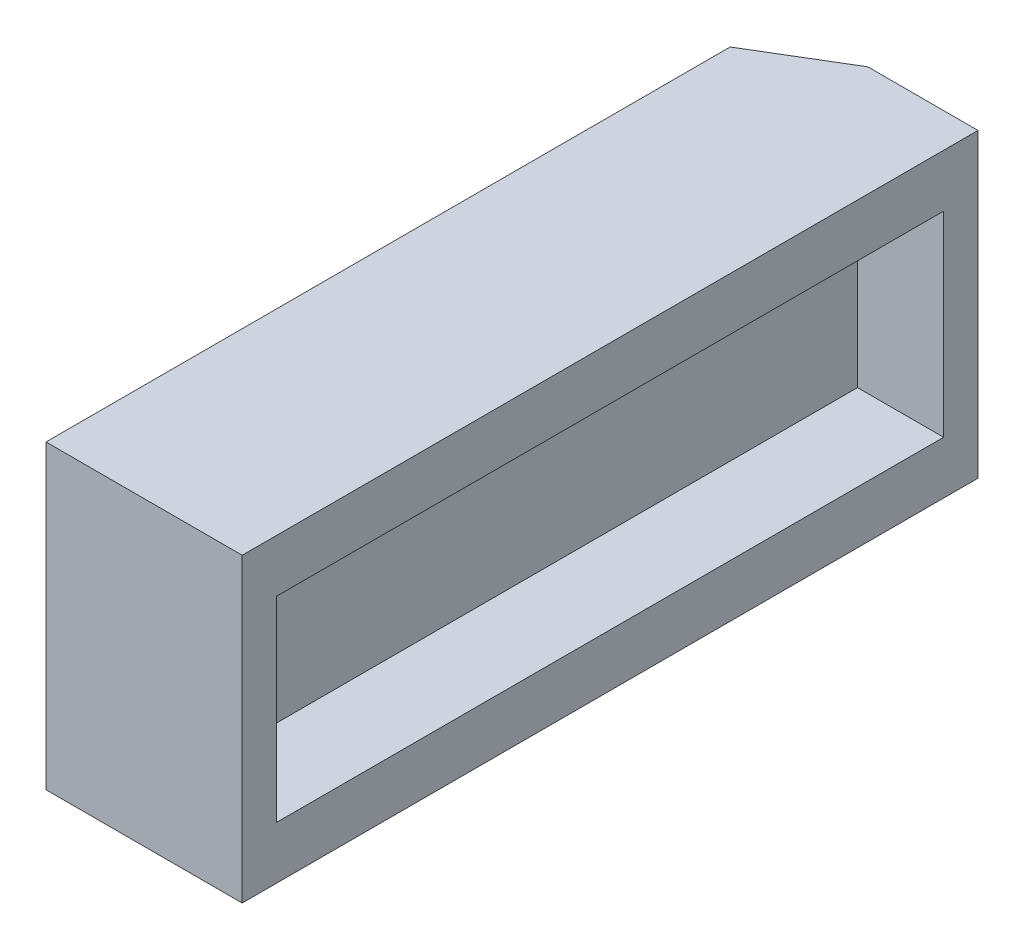
ISO-10303-21;
HEADER;
FILE_DESCRIPTION(('STEP AP214'),'2;1');
FILE_NAME('part.step','',(''),(''),'','','');
FILE_SCHEMA(('AUTOMOTIVE_DESIGN { 1 0 10303 214 1 1 1 1 }'));
ENDSEC;
DATA;
#1=APPLICATION_CONTEXT('core data for automotive mechanical design processes');
#2=APPLICATION_PROTOCOL_DEFINITION('international standard','automotive_design',2000,#1);
#3=PRODUCT_CONTEXT('',#1,'mechanical');
#4=PRODUCT('Part','Part','',(#3));
#5=PRODUCT_RELATED_PRODUCT_CATEGORY('part','',(#4));
#6=PRODUCT_DEFINITION_FORMATION('','',#4);
#7=PRODUCT_DEFINITION_CONTEXT('part definition',#1,'design');
#8=PRODUCT_DEFINITION('design','',#6,#7);
#9=PRODUCT_DEFINITION_SHAPE('','',#8);
#10=(LENGTH_UNIT() NAMED_UNIT(*) SI_UNIT(.MILLI.,.METRE.));
#11=(NAMED_UNIT(*) PLANE_ANGLE_UNIT() SI_UNIT($,.RADIAN.));
#12=(NAMED_UNIT(*) SI_UNIT($,.STERADIAN.) SOLID_ANGLE_UNIT());
#13=UNCERTAINTY_MEASURE_WITH_UNIT(LENGTH_MEASURE(1.E-05),#10,'distance_accuracy_value','');
#14=(GEOMETRIC_REPRESENTATION_CONTEXT(3) GLOBAL_UNCERTAINTY_ASSIGNED_CONTEXT((#13)) GLOBAL_UNIT_ASSIGNED_CONTEXT((#10,
#11,#12)) REPRESENTATION_CONTEXT('',''));
#15=CARTESIAN_POINT('',(0.,0.,0.));
#16=DIRECTION('',(0.,0.,1.));
#17=DIRECTION('',(1.,0.,0.));
#18=AXIS2_PLACEMENT_3D('',#15,#16,#17);
#19=CARTESIAN_POINT('',(12.7,0.,0.));
#20=DIRECTION('',(1.,0.,0.));
#21=DIRECTION('',(0.,0.,-1.));
#22=AXIS2_PLACEMENT_3D('',#19,#20,#21);
#23=PLANE('',#22);
#24=DIRECTION('',(0.,-1.,0.));
#25=VECTOR('',#24,1.);
#26=CARTESIAN_POINT('',(12.7,36.6776,5.08));
#27=LINE('',#26,#25);
#28=CARTESIAN_POINT('',(12.7,36.6776,5.08));
#29=VERTEX_POINT('',#28);
#30=CARTESIAN_POINT('',(12.7,-7.7724,5.08));
#31=VERTEX_POINT('',#30);
#32=EDGE_CURVE('E356',#29,#31,#27,.T.);
#33=ORIENTED_EDGE('',*,*,#32,.T.);
#34=DIRECTION('',(0.,0.,-1.));
#35=VECTOR('',#34,1.);
#36=CARTESIAN_POINT('',(12.7,-7.7724,5.08));
#37=LINE('',#36,#35);
#38=CARTESIAN_POINT('',(12.7,-7.7724,-103.505));
#39=VERTEX_POINT('',#38);
#40=EDGE_CURVE('E359',#31,#39,#37,.T.);
#41=ORIENTED_EDGE('',*,*,#40,.T.);
#42=DIRECTION('',(0.,1.,0.));
#43=VECTOR('',#42,1.);
#44=CARTESIAN_POINT('',(12.7,36.6776,-103.505));
#45=LINE('',#44,#43);
#46=CARTESIAN_POINT('',(12.7,36.6776,-103.505));
#47=VERTEX_POINT('',#46);
#48=EDGE_CURVE('E196',#39,#47,#45,.T.);
#49=ORIENTED_EDGE('',*,*,#48,.T.);
#50=DIRECTION('',(0.,0.,1.));
#51=VECTOR('',#50,1.);
#52=CARTESIAN_POINT('',(12.7,36.6776,5.08));
#53=LINE('',#52,#51);
#54=EDGE_CURVE('E362',#47,#29,#53,.T.);
#55=ORIENTED_EDGE('',*,*,#54,.T.);
#56=EDGE_LOOP('',(#33,#41,#49,#55));
#57=FACE_BOUND('',#56,.T.);
#58=DIRECTION('',(0.,0.,-1.));
#59=VECTOR('',#58,1.);
#60=CARTESIAN_POINT('',(12.7,0.,0.));
#61=LINE('',#60,#59);
#62=CARTESIAN_POINT('',(12.7,0.,0.));
#63=VERTEX_POINT('',#62);
#64=CARTESIAN_POINT('',(12.7,0.,-98.425));
#65=VERTEX_POINT('',#64);
#66=EDGE_CURVE('E329',#63,#65,#61,.T.);
#67=ORIENTED_EDGE('',*,*,#66,.F.);
#68=DIRECTION('',(0.,-1.,0.));
#69=VECTOR('',#68,1.);
#70=CARTESIAN_POINT('',(12.7,0.,0.));
#71=LINE('',#70,#69);
#72=CARTESIAN_POINT('',(12.7,28.9052,0.));
#73=VERTEX_POINT('',#72);
#74=EDGE_CURVE('E327',#73,#63,#71,.T.);
#75=ORIENTED_EDGE('',*,*,#74,.F.);
#76=DIRECTION('',(0.,0.,1.));
#77=VECTOR('',#76,1.);
#78=CARTESIAN_POINT('',(12.7,28.9052,0.));
#79=LINE('',#78,#77);
#80=CARTESIAN_POINT('',(12.7,28.9052,-98.425));
#81=VERTEX_POINT('',#80);
#82=EDGE_CURVE('E335',#81,#73,#79,.T.);
#83=ORIENTED_EDGE('',*,*,#82,.F.);
#84=DIRECTION('',(0.,1.,0.));
#85=VECTOR('',#84,1.);
#86=CARTESIAN_POINT('',(12.7,0.,-98.425));
#87=LINE('',#86,#85);
#88=EDGE_CURVE('E332',#65,#81,#87,.T.);
#89=ORIENTED_EDGE('',*,*,#88,.F.);
#90=EDGE_LOOP('',(#67,#75,#83,#89));
#91=FACE_BOUND('',#90,.T.);
#92=ADVANCED_FACE('F35',(#57,#91),#23,.T.);
#93=CARTESIAN_POINT('',(12.7,36.6776,5.08));
#94=DIRECTION('',(0.,0.,-1.));
#95=DIRECTION('',(-1.,0.,0.));
#96=AXIS2_PLACEMENT_3D('',#93,#94,#95);
#97=PLANE('',#96);
#98=DIRECTION('',(-1.,0.,0.));
#99=VECTOR('',#98,1.);
#100=CARTESIAN_POINT('',(12.7,36.6776,5.08));
#101=LINE('',#100,#99);
#102=CARTESIAN_POINT('',(-16.256,36.6776,5.07999999999999));
#103=VERTEX_POINT('',#102);
#104=EDGE_CURVE('E203',#29,#103,#101,.T.);
#105=ORIENTED_EDGE('',*,*,#104,.T.);
#106=DIRECTION('',(0.,1.,0.));
#107=VECTOR('',#106,1.);
#108=CARTESIAN_POINT('',(-16.256,36.6776,5.07999999999999));
#109=LINE('',#108,#107);
#110=CARTESIAN_POINT('',(-16.256,-7.7724,5.08));
#111=VERTEX_POINT('',#110);
#112=EDGE_CURVE('E316',#111,#103,#109,.T.);
#113=ORIENTED_EDGE('',*,*,#112,.F.);
#114=DIRECTION('',(-1.,0.,0.));
#115=VECTOR('',#114,1.);
#116=CARTESIAN_POINT('',(12.7,-7.7724,5.08));
#117=LINE('',#116,#115);
#118=EDGE_CURVE('E197',#31,#111,#117,.T.);
#119=ORIENTED_EDGE('',*,*,#118,.F.);
#120=ORIENTED_EDGE('',*,*,#32,.F.);
#121=EDGE_LOOP('',(#105,#113,#119,#120));
#122=FACE_BOUND('',#121,.T.);
#123=ADVANCED_FACE('F368',(#122),#97,.F.);
#124=CARTESIAN_POINT('',(12.7,-7.7724,5.08));
#125=DIRECTION('',(0.,1.,0.));
#126=DIRECTION('',(0.,0.,1.));
#127=AXIS2_PLACEMENT_3D('',#124,#125,#126);
#128=PLANE('',#127);
#129=ORIENTED_EDGE('',*,*,#118,.T.);
#130=DIRECTION('',(0.,0.,1.));
#131=VECTOR('',#130,1.);
#132=CARTESIAN_POINT('',(-16.256,-7.7724,5.08));
#133=LINE('',#132,#131);
#134=CARTESIAN_POINT('',(-16.256,-7.7724,-95.885));
#135=VERTEX_POINT('',#134);
#136=EDGE_CURVE('E191',#135,#111,#133,.T.);
#137=ORIENTED_EDGE('',*,*,#136,.F.);
#138=DIRECTION('',(0.857492925712544,0.,-0.514495755427527));
#139=VECTOR('',#138,1.);
#140=CARTESIAN_POINT('',(-16.256,-7.7724,-95.885));
#141=LINE('',#140,#139);
#142=CARTESIAN_POINT('',(-3.556,-7.7724,-103.505));
#143=VERTEX_POINT('',#142);
#144=EDGE_CURVE('E171',#135,#143,#141,.T.);
#145=ORIENTED_EDGE('',*,*,#144,.T.);
#146=DIRECTION('',(-1.,0.,0.));
#147=VECTOR('',#146,1.);
#148=CARTESIAN_POINT('',(12.7,-7.7724,-103.505));
#149=LINE('',#148,#147);
#150=EDGE_CURVE('E188',#39,#143,#149,.T.);
#151=ORIENTED_EDGE('',*,*,#150,.F.);
#152=ORIENTED_EDGE('',*,*,#40,.F.);
#153=EDGE_LOOP('',(#129,#137,#145,#151,#152));
#154=FACE_BOUND('',#153,.T.);
#155=ADVANCED_FACE('F187',(#154),#128,.F.);
#156=CARTESIAN_POINT('',(12.7,36.6776,-103.505));
#157=DIRECTION('',(0.,0.,1.));
#158=DIRECTION('',(1.,0.,0.));
#159=AXIS2_PLACEMENT_3D('',#156,#157,#158);
#160=PLANE('',#159);
#161=ORIENTED_EDGE('',*,*,#150,.T.);
#162=DIRECTION('',(0.,-1.,0.));
#163=VECTOR('',#162,1.);
#164=CARTESIAN_POINT('',(-3.556,14.7344178129071,-103.505));
#165=LINE('',#164,#163);
#166=CARTESIAN_POINT('',(-3.556,2.4638,-103.505));
#167=VERTEX_POINT('',#166);
#168=EDGE_CURVE('E168',#167,#143,#165,.T.);
#169=ORIENTED_EDGE('',*,*,#168,.F.);
#170=DIRECTION('',(0.,-1.,0.));
#171=VECTOR('',#170,1.);
#172=CARTESIAN_POINT('',(-3.556,36.6776,-103.505));
#173=LINE('',#172,#171);
#174=CARTESIAN_POINT('',(-3.556,26.4414,-103.505));
#175=VERTEX_POINT('',#174);
#176=EDGE_CURVE('E323',#175,#167,#173,.T.);
#177=ORIENTED_EDGE('',*,*,#176,.F.);
#178=CARTESIAN_POINT('',(-3.556,36.6776,-103.505));
#179=VERTEX_POINT('',#178);
#180=EDGE_CURVE('E324',#179,#175,#173,.T.);
#181=ORIENTED_EDGE('',*,*,#180,.F.);
#182=DIRECTION('',(-1.,0.,0.));
#183=VECTOR('',#182,1.);
#184=CARTESIAN_POINT('',(12.7,36.6776,-103.505));
#185=LINE('',#184,#183);
#186=EDGE_CURVE('E198',#47,#179,#185,.T.);
#187=ORIENTED_EDGE('',*,*,#186,.F.);
#188=ORIENTED_EDGE('',*,*,#48,.F.);
#189=EDGE_LOOP('',(#161,#169,#177,#181,#187,#188));
#190=FACE_BOUND('',#189,.T.);
#191=ADVANCED_FACE('F194',(#190),#160,.F.);
#192=CARTESIAN_POINT('',(12.7,36.6776,5.08));
#193=DIRECTION('',(0.,-1.,0.));
#194=DIRECTION('',(0.,0.,-1.));
#195=AXIS2_PLACEMENT_3D('',#192,#193,#194);
#196=PLANE('',#195);
#197=ORIENTED_EDGE('',*,*,#186,.T.);
#198=DIRECTION('',(-0.857492925712544,0.,0.514495755427527));
#199=VECTOR('',#198,1.);
#200=CARTESIAN_POINT('',(-16.256,36.6776,-95.885));
#201=LINE('',#200,#199);
#202=CARTESIAN_POINT('',(-16.256,36.6776,-95.885));
#203=VERTEX_POINT('',#202);
#204=EDGE_CURVE('E181',#179,#203,#201,.T.);
#205=ORIENTED_EDGE('',*,*,#204,.T.);
#206=DIRECTION('',(0.,0.,-1.));
#207=VECTOR('',#206,1.);
#208=CARTESIAN_POINT('',(-16.256,36.6776,5.07999999999999));
#209=LINE('',#208,#207);
#210=EDGE_CURVE('E319',#103,#203,#209,.T.);
#211=ORIENTED_EDGE('',*,*,#210,.F.);
#212=ORIENTED_EDGE('',*,*,#104,.F.);
#213=ORIENTED_EDGE('',*,*,#54,.F.);
#214=EDGE_LOOP('',(#197,#205,#211,#212,#213));
#215=FACE_BOUND('',#214,.T.);
#216=ADVANCED_FACE('F372',(#215),#196,.F.);
#217=CARTESIAN_POINT('',(12.7,0.,0.));
#218=DIRECTION('',(0.,0.,-1.));
#219=DIRECTION('',(0.,1.,0.));
#220=AXIS2_PLACEMENT_3D('',#217,#218,#219);
#221=PLANE('',#220);
#222=DIRECTION('',(0.,-1.,0.));
#223=VECTOR('',#222,1.);
#224=CARTESIAN_POINT('',(0.,0.,0.));
#225=LINE('',#224,#223);
#226=CARTESIAN_POINT('',(0.,28.9052,0.));
#227=VERTEX_POINT('',#226);
#228=CARTESIAN_POINT('',(0.,0.,0.));
#229=VERTEX_POINT('',#228);
#230=EDGE_CURVE('E326',#227,#229,#225,.T.);
#231=ORIENTED_EDGE('',*,*,#230,.F.);
#232=DIRECTION('',(-1.,0.,0.));
#233=VECTOR('',#232,1.);
#234=CARTESIAN_POINT('',(12.7,28.9052,0.));
#235=LINE('',#234,#233);
#236=EDGE_CURVE('E337',#73,#227,#235,.T.);
#237=ORIENTED_EDGE('',*,*,#236,.F.);
#238=ORIENTED_EDGE('',*,*,#74,.T.);
#239=DIRECTION('',(-1.,0.,0.));
#240=VECTOR('',#239,1.);
#241=CARTESIAN_POINT('',(12.7,0.,0.));
#242=LINE('',#241,#240);
#243=EDGE_CURVE('E353',#63,#229,#242,.T.);
#244=ORIENTED_EDGE('',*,*,#243,.T.);
#245=EDGE_LOOP('',(#231,#237,#238,#244));
#246=FACE_BOUND('',#245,.T.);
#247=ADVANCED_FACE('F404',(#246),#221,.T.);
#248=CARTESIAN_POINT('',(12.7,0.,0.));
#249=DIRECTION('',(0.,1.,0.));
#250=DIRECTION('',(0.,0.,1.));
#251=AXIS2_PLACEMENT_3D('',#248,#249,#250);
#252=PLANE('',#251);
#253=DIRECTION('',(0.,0.,-1.));
#254=VECTOR('',#253,1.);
#255=CARTESIAN_POINT('',(0.,0.,0.));
#256=LINE('',#255,#254);
#257=CARTESIAN_POINT('',(0.,0.,-98.425));
#258=VERTEX_POINT('',#257);
#259=EDGE_CURVE('E340',#229,#258,#256,.T.);
#260=ORIENTED_EDGE('',*,*,#259,.F.);
#261=ORIENTED_EDGE('',*,*,#243,.F.);
#262=ORIENTED_EDGE('',*,*,#66,.T.);
#263=DIRECTION('',(-1.,0.,0.));
#264=VECTOR('',#263,1.);
#265=CARTESIAN_POINT('',(12.7,0.,-98.425));
#266=LINE('',#265,#264);
#267=EDGE_CURVE('E351',#65,#258,#266,.T.);
#268=ORIENTED_EDGE('',*,*,#267,.T.);
#269=EDGE_LOOP('',(#260,#261,#262,#268));
#270=FACE_BOUND('',#269,.T.);
#271=ADVANCED_FACE('F589',(#270),#252,.T.);
#272=CARTESIAN_POINT('',(12.7,0.,-98.425));
#273=DIRECTION('',(0.,0.,1.));
#274=DIRECTION('',(1.,0.,0.));
#275=AXIS2_PLACEMENT_3D('',#272,#273,#274);
#276=PLANE('',#275);
#277=DIRECTION('',(0.,1.,0.));
#278=VECTOR('',#277,1.);
#279=CARTESIAN_POINT('',(0.,0.,-98.425));
#280=LINE('',#279,#278);
#281=CARTESIAN_POINT('',(0.,28.9052,-98.425));
#282=VERTEX_POINT('',#281);
#283=EDGE_CURVE('E343',#258,#282,#280,.T.);
#284=ORIENTED_EDGE('',*,*,#283,.F.);
#285=ORIENTED_EDGE('',*,*,#267,.F.);
#286=ORIENTED_EDGE('',*,*,#88,.T.);
#287=DIRECTION('',(-1.,0.,0.));
#288=VECTOR('',#287,1.);
#289=CARTESIAN_POINT('',(12.7,28.9052,-98.425));
#290=LINE('',#289,#288);
#291=EDGE_CURVE('E349',#81,#282,#290,.T.);
#292=ORIENTED_EDGE('',*,*,#291,.T.);
#293=EDGE_LOOP('',(#284,#285,#286,#292));
#294=FACE_BOUND('',#293,.T.);
#295=ADVANCED_FACE('F596',(#294),#276,.T.);
#296=CARTESIAN_POINT('',(12.7,28.9052,0.));
#297=DIRECTION('',(0.,-1.,0.));
#298=DIRECTION('',(0.,0.,-1.));
#299=AXIS2_PLACEMENT_3D('',#296,#297,#298);
#300=PLANE('',#299);
#301=DIRECTION('',(0.,0.,1.));
#302=VECTOR('',#301,1.);
#303=CARTESIAN_POINT('',(0.,28.9052,0.));
#304=LINE('',#303,#302);
#305=EDGE_CURVE('E330',#282,#227,#304,.T.);
#306=ORIENTED_EDGE('',*,*,#305,.F.);
#307=ORIENTED_EDGE('',*,*,#291,.F.);
#308=ORIENTED_EDGE('',*,*,#82,.T.);
#309=ORIENTED_EDGE('',*,*,#236,.T.);
#310=EDGE_LOOP('',(#306,#307,#308,#309));
#311=FACE_BOUND('',#310,.T.);
#312=ADVANCED_FACE('F603',(#311),#300,.T.);
#313=CARTESIAN_POINT('',(0.,0.,0.));
#314=DIRECTION('',(-1.,0.,0.));
#315=DIRECTION('',(0.,0.,1.));
#316=AXIS2_PLACEMENT_3D('',#313,#314,#315);
#317=PLANE('',#316);
#318=ORIENTED_EDGE('',*,*,#305,.T.);
#319=ORIENTED_EDGE('',*,*,#230,.T.);
#320=ORIENTED_EDGE('',*,*,#259,.T.);
#321=ORIENTED_EDGE('',*,*,#283,.T.);
#322=EDGE_LOOP('',(#318,#319,#320,#321));
#323=FACE_BOUND('',#322,.T.);
#324=ADVANCED_FACE('F569',(#323),#317,.F.);
#325=CARTESIAN_POINT('',(-3.556,0.,0.));
#326=DIRECTION('',(-1.,0.,0.));
#327=DIRECTION('',(0.,0.,1.));
#328=AXIS2_PLACEMENT_3D('',#325,#326,#327);
#329=PLANE('',#328);
#330=ORIENTED_EDGE('',*,*,#176,.T.);
#331=DIRECTION('',(0.,0.,1.));
#332=VECTOR('',#331,1.);
#333=CARTESIAN_POINT('',(-3.556,2.4638,-95.885));
#334=LINE('',#333,#332);
#335=CARTESIAN_POINT('',(-3.556,2.4638,-98.425));
#336=VERTEX_POINT('',#335);
#337=EDGE_CURVE('E222',#167,#336,#334,.T.);
#338=ORIENTED_EDGE('',*,*,#337,.T.);
#339=DIRECTION('',(0.,-1.,0.));
#340=VECTOR('',#339,1.);
#341=CARTESIAN_POINT('',(-3.556,0.,-98.425));
#342=LINE('',#341,#340);
#343=CARTESIAN_POINT('',(-3.556,26.4414,-98.425));
#344=VERTEX_POINT('',#343);
#345=EDGE_CURVE('E220',#336,#344,#342,.F.);
#346=ORIENTED_EDGE('',*,*,#345,.T.);
#347=DIRECTION('',(0.,0.,-1.));
#348=VECTOR('',#347,1.);
#349=CARTESIAN_POINT('',(-3.556,26.4414,-103.505));
#350=LINE('',#349,#348);
#351=EDGE_CURVE('E217',#344,#175,#350,.T.);
#352=ORIENTED_EDGE('',*,*,#351,.T.);
#353=EDGE_LOOP('',(#330,#338,#346,#352));
#354=FACE_BOUND('',#353,.T.);
#355=ADVANCED_FACE('F385',(#354),#329,.T.);
#356=CARTESIAN_POINT('',(-16.256,0.,0.));
#357=DIRECTION('',(1.,0.,0.));
#358=DIRECTION('',(0.,0.,-1.));
#359=AXIS2_PLACEMENT_3D('',#356,#357,#358);
#360=PLANE('',#359);
#361=ORIENTED_EDGE('',*,*,#112,.T.);
#362=ORIENTED_EDGE('',*,*,#210,.T.);
#363=DIRECTION('',(0.,-1.,0.));
#364=VECTOR('',#363,1.);
#365=CARTESIAN_POINT('',(-16.256,36.6776,-95.885));
#366=LINE('',#365,#364);
#367=CARTESIAN_POINT('',(-16.256,26.4414,-95.885));
#368=VERTEX_POINT('',#367);
#369=EDGE_CURVE('E53',#203,#368,#366,.T.);
#370=ORIENTED_EDGE('',*,*,#369,.T.);
#371=CARTESIAN_POINT('',(-16.256,2.4638,-95.885));
#372=VERTEX_POINT('',#371);
#373=EDGE_CURVE('E266',#368,#372,#366,.T.);
#374=ORIENTED_EDGE('',*,*,#373,.T.);
#375=DIRECTION('',(0.,-1.,0.));
#376=VECTOR('',#375,1.);
#377=CARTESIAN_POINT('',(-16.256,14.7344178129071,-95.885));
#378=LINE('',#377,#376);
#379=EDGE_CURVE('E192',#372,#135,#378,.T.);
#380=ORIENTED_EDGE('',*,*,#379,.T.);
#381=ORIENTED_EDGE('',*,*,#136,.T.);
#382=EDGE_LOOP('',(#361,#362,#370,#374,#380,#381));
#383=FACE_BOUND('',#382,.T.);
#384=DIRECTION('',(0.,1.,0.));
#385=VECTOR('',#384,1.);
#386=CARTESIAN_POINT('',(-16.256,28.9814,0.));
#387=LINE('',#386,#385);
#388=CARTESIAN_POINT('',(-16.256,-0.0761999999999985,0.));
#389=VERTEX_POINT('',#388);
#390=CARTESIAN_POINT('',(-16.256,28.9814,0.));
#391=VERTEX_POINT('',#390);
#392=EDGE_CURVE('E288',#389,#391,#387,.T.);
#393=ORIENTED_EDGE('',*,*,#392,.F.);
#394=DIRECTION('',(0.,0.,1.));
#395=VECTOR('',#394,1.);
#396=CARTESIAN_POINT('',(-16.256,-0.0761999999999985,0.));
#397=LINE('',#396,#395);
#398=CARTESIAN_POINT('',(-16.256,-0.0761999999999985,-90.805));
#399=VERTEX_POINT('',#398);
#400=EDGE_CURVE('E296',#399,#389,#397,.T.);
#401=ORIENTED_EDGE('',*,*,#400,.F.);
#402=DIRECTION('',(0.,-1.,0.));
#403=VECTOR('',#402,1.);
#404=CARTESIAN_POINT('',(-16.256,28.9814,-90.805));
#405=LINE('',#404,#403);
#406=CARTESIAN_POINT('',(-16.256,28.9814,-90.805));
#407=VERTEX_POINT('',#406);
#408=EDGE_CURVE('E293',#407,#399,#405,.T.);
#409=ORIENTED_EDGE('',*,*,#408,.F.);
#410=DIRECTION('',(0.,0.,-1.));
#411=VECTOR('',#410,1.);
#412=CARTESIAN_POINT('',(-16.256,28.9814,0.));
#413=LINE('',#412,#411);
#414=EDGE_CURVE('E290',#391,#407,#413,.T.);
#415=ORIENTED_EDGE('',*,*,#414,.F.);
#416=EDGE_LOOP('',(#393,#401,#409,#415));
#417=FACE_BOUND('',#416,.T.);
#418=ADVANCED_FACE('F373',(#383,#417),#360,.F.);
#419=CARTESIAN_POINT('',(-16.256,36.6776,-95.885));
#420=DIRECTION('',(0.,0.,1.));
#421=DIRECTION('',(0.,-1.,0.));
#422=AXIS2_PLACEMENT_3D('',#419,#420,#421);
#423=PLANE('',#422);
#424=DIRECTION('',(0.,-1.,0.));
#425=VECTOR('',#424,1.);
#426=CARTESIAN_POINT('',(-6.096,36.6776,-95.885));
#427=LINE('',#426,#425);
#428=CARTESIAN_POINT('',(-6.096,26.4414,-95.885));
#429=VERTEX_POINT('',#428);
#430=CARTESIAN_POINT('',(-6.096,2.4638,-95.885));
#431=VERTEX_POINT('',#430);
#432=EDGE_CURVE('E208',#429,#431,#427,.T.);
#433=ORIENTED_EDGE('',*,*,#432,.T.);
#434=DIRECTION('',(-1.,0.,0.));
#435=VECTOR('',#434,1.);
#436=CARTESIAN_POINT('',(-16.256,2.4638,-95.885));
#437=LINE('',#436,#435);
#438=EDGE_CURVE('E210',#431,#372,#437,.T.);
#439=ORIENTED_EDGE('',*,*,#438,.T.);
#440=ORIENTED_EDGE('',*,*,#373,.F.);
#441=DIRECTION('',(1.,0.,0.));
#442=VECTOR('',#441,1.);
#443=CARTESIAN_POINT('',(-16.256,26.4414,-95.885));
#444=LINE('',#443,#442);
#445=EDGE_CURVE('E200',#368,#429,#444,.T.);
#446=ORIENTED_EDGE('',*,*,#445,.T.);
#447=EDGE_LOOP('',(#433,#439,#440,#446));
#448=FACE_BOUND('',#447,.T.);
#449=ADVANCED_FACE('F263',(#448),#423,.F.);
#450=CARTESIAN_POINT('',(-16.256,28.9814,0.));
#451=DIRECTION('',(0.,0.,-1.));
#452=DIRECTION('',(-1.,0.,0.));
#453=AXIS2_PLACEMENT_3D('',#450,#451,#452);
#454=PLANE('',#453);
#455=DIRECTION('',(0.,1.,0.));
#456=VECTOR('',#455,1.);
#457=CARTESIAN_POINT('',(-3.556,28.9814,0.));
#458=LINE('',#457,#456);
#459=CARTESIAN_POINT('',(-3.556,-0.0761999999999985,0.));
#460=VERTEX_POINT('',#459);
#461=CARTESIAN_POINT('',(-3.556,28.9814,0.));
#462=VERTEX_POINT('',#461);
#463=EDGE_CURVE('E280',#460,#462,#458,.T.);
#464=ORIENTED_EDGE('',*,*,#463,.F.);
#465=DIRECTION('',(1.,0.,0.));
#466=VECTOR('',#465,1.);
#467=CARTESIAN_POINT('',(-16.256,-0.0761999999999985,0.));
#468=LINE('',#467,#466);
#469=EDGE_CURVE('E297',#389,#460,#468,.T.);
#470=ORIENTED_EDGE('',*,*,#469,.F.);
#471=ORIENTED_EDGE('',*,*,#392,.T.);
#472=DIRECTION('',(1.,0.,0.));
#473=VECTOR('',#472,1.);
#474=CARTESIAN_POINT('',(-16.256,28.9814,0.));
#475=LINE('',#474,#473);
#476=EDGE_CURVE('E313',#391,#462,#475,.T.);
#477=ORIENTED_EDGE('',*,*,#476,.T.);
#478=EDGE_LOOP('',(#464,#470,#471,#477));
#479=FACE_BOUND('',#478,.T.);
#480=ADVANCED_FACE('F540',(#479),#454,.T.);
#481=CARTESIAN_POINT('',(-16.256,28.9814,0.));
#482=DIRECTION('',(0.,-1.,0.));
#483=DIRECTION('',(0.,0.,-1.));
#484=AXIS2_PLACEMENT_3D('',#481,#482,#483);
#485=PLANE('',#484);
#486=DIRECTION('',(0.,0.,-1.));
#487=VECTOR('',#486,1.);
#488=CARTESIAN_POINT('',(-3.556,28.9814,0.));
#489=LINE('',#488,#487);
#490=CARTESIAN_POINT('',(-3.556,28.9814,-90.805));
#491=VERTEX_POINT('',#490);
#492=EDGE_CURVE('E283',#462,#491,#489,.T.);
#493=ORIENTED_EDGE('',*,*,#492,.F.);
#494=ORIENTED_EDGE('',*,*,#476,.F.);
#495=ORIENTED_EDGE('',*,*,#414,.T.);
#496=DIRECTION('',(1.,0.,0.));
#497=VECTOR('',#496,1.);
#498=CARTESIAN_POINT('',(-16.256,28.9814,-90.805));
#499=LINE('',#498,#497);
#500=EDGE_CURVE('E311',#407,#491,#499,.T.);
#501=ORIENTED_EDGE('',*,*,#500,.T.);
#502=EDGE_LOOP('',(#493,#494,#495,#501));
#503=FACE_BOUND('',#502,.T.);
#504=ADVANCED_FACE('F531',(#503),#485,.T.);
#505=CARTESIAN_POINT('',(-16.256,28.9814,-90.805));
#506=DIRECTION('',(0.,0.,1.));
#507=DIRECTION('',(1.,0.,0.));
#508=AXIS2_PLACEMENT_3D('',#505,#506,#507);
#509=PLANE('',#508);
#510=DIRECTION('',(0.,-1.,0.));
#511=VECTOR('',#510,1.);
#512=CARTESIAN_POINT('',(-3.556,28.9814,-90.805));
#513=LINE('',#512,#511);
#514=CARTESIAN_POINT('',(-3.556,-0.0761999999999985,-90.805));
#515=VERTEX_POINT('',#514);
#516=EDGE_CURVE('E301',#491,#515,#513,.T.);
#517=ORIENTED_EDGE('',*,*,#516,.F.);
#518=ORIENTED_EDGE('',*,*,#500,.F.);
#519=ORIENTED_EDGE('',*,*,#408,.T.);
#520=DIRECTION('',(1.,0.,0.));
#521=VECTOR('',#520,1.);
#522=CARTESIAN_POINT('',(-16.256,-0.0761999999999985,-90.805));
#523=LINE('',#522,#521);
#524=EDGE_CURVE('E308',#399,#515,#523,.T.);
#525=ORIENTED_EDGE('',*,*,#524,.T.);
#526=EDGE_LOOP('',(#517,#518,#519,#525));
#527=FACE_BOUND('',#526,.T.);
#528=ADVANCED_FACE('F522',(#527),#509,.T.);
#529=CARTESIAN_POINT('',(-16.256,-0.0761999999999985,0.));
#530=DIRECTION('',(0.,1.,0.));
#531=DIRECTION('',(0.,0.,1.));
#532=AXIS2_PLACEMENT_3D('',#529,#530,#531);
#533=PLANE('',#532);
#534=DIRECTION('',(0.,0.,1.));
#535=VECTOR('',#534,1.);
#536=CARTESIAN_POINT('',(-3.556,-0.0761999999999985,0.));
#537=LINE('',#536,#535);
#538=EDGE_CURVE('E291',#515,#460,#537,.T.);
#539=ORIENTED_EDGE('',*,*,#538,.F.);
#540=ORIENTED_EDGE('',*,*,#524,.F.);
#541=ORIENTED_EDGE('',*,*,#400,.T.);
#542=ORIENTED_EDGE('',*,*,#469,.T.);
#543=EDGE_LOOP('',(#539,#540,#541,#542));
#544=FACE_BOUND('',#543,.T.);
#545=ADVANCED_FACE('F516',(#544),#533,.T.);
#546=ORIENTED_EDGE('',*,*,#516,.T.);
#547=ORIENTED_EDGE('',*,*,#538,.T.);
#548=ORIENTED_EDGE('',*,*,#463,.T.);
#549=ORIENTED_EDGE('',*,*,#492,.T.);
#550=EDGE_LOOP('',(#546,#547,#548,#549));
#551=FACE_BOUND('',#550,.T.);
#552=ADVANCED_FACE('F503',(#551),#329,.T.);
#553=CARTESIAN_POINT('',(-16.256,28.9814,0.));
#554=DIRECTION('',(0.,-1.,0.));
#555=DIRECTION('',(0.,0.,-1.));
#556=AXIS2_PLACEMENT_3D('',#553,#554,#555);
#557=PLANE('',#556);
#558=DIRECTION('',(0.,0.,-1.));
#559=VECTOR('',#558,1.);
#560=CARTESIAN_POINT('',(-6.096,28.9814,-95.885));
#561=LINE('',#560,#559);
#562=CARTESIAN_POINT('',(-6.096,28.9814,-101.981));
#563=VERTEX_POINT('',#562);
#564=CARTESIAN_POINT('',(-6.096,28.9814,-98.425));
#565=VERTEX_POINT('',#564);
#566=EDGE_CURVE('E224',#563,#565,#561,.F.);
#567=ORIENTED_EDGE('',*,*,#566,.T.);
#568=DIRECTION('',(1.,0.,0.));
#569=VECTOR('',#568,1.);
#570=CARTESIAN_POINT('',(-16.256,28.9814,-98.425));
#571=LINE('',#570,#569);
#572=CARTESIAN_POINT('',(-12.0226666666667,28.9814,-98.425));
#573=VERTEX_POINT('',#572);
#574=EDGE_CURVE('E226',#565,#573,#571,.F.);
#575=ORIENTED_EDGE('',*,*,#574,.T.);
#576=DIRECTION('',(-0.857492925712544,0.,0.514495755427527));
#577=VECTOR('',#576,1.);
#578=CARTESIAN_POINT('',(-16.256,28.9814,-95.885));
#579=LINE('',#578,#577);
#580=EDGE_CURVE('E275',#563,#573,#579,.T.);
#581=ORIENTED_EDGE('',*,*,#580,.F.);
#582=EDGE_LOOP('',(#567,#575,#581));
#583=FACE_BOUND('',#582,.T.);
#584=ADVANCED_FACE('F274',(#583),#557,.T.);
#585=CARTESIAN_POINT('',(-16.256,14.1707821870929,-95.885));
#586=DIRECTION('',(-0.514495755427527,0.,-0.857492925712544));
#587=DIRECTION('',(-0.857492925712544,0.,0.514495755427527));
#588=AXIS2_PLACEMENT_3D('',#585,#586,#587);
#589=PLANE('',#588);
#590=ORIENTED_EDGE('',*,*,#180,.T.);
#591=CARTESIAN_POINT('',(-6.096,26.4414,-101.981));
#592=DIRECTION('',(-0.514495755427527,0.,-0.857492925712544));
#593=DIRECTION('',(-0.857492925712544,0.,0.514495755427527));
#594=AXIS2_PLACEMENT_3D('',#591,#592,#593);
#595=ELLIPSE('',#594,2.96212356258141,2.54);
#596=EDGE_CURVE('E11',#175,#563,#595,.F.);
#597=ORIENTED_EDGE('',*,*,#596,.T.);
#598=ORIENTED_EDGE('',*,*,#580,.T.);
#599=CARTESIAN_POINT('',(-12.0226666666667,26.4414,-98.425));
#600=DIRECTION('',(-0.514495755427527,0.,-0.857492925712544));
#601=DIRECTION('',(0.857492925712544,0.,-0.514495755427527));
#602=AXIS2_PLACEMENT_3D('',#599,#600,#601);
#603=ELLIPSE('',#602,4.93687260430235,2.54);
#604=EDGE_CURVE('E45',#573,#368,#603,.F.);
#605=ORIENTED_EDGE('',*,*,#604,.T.);
#606=ORIENTED_EDGE('',*,*,#369,.F.);
#607=ORIENTED_EDGE('',*,*,#204,.F.);
#608=EDGE_LOOP('',(#590,#597,#598,#605,#606,#607));
#609=FACE_BOUND('',#608,.T.);
#610=ADVANCED_FACE('F278',(#609),#589,.T.);
#611=CARTESIAN_POINT('',(-16.256,-0.0761999999999985,0.));
#612=DIRECTION('',(0.,1.,0.));
#613=DIRECTION('',(0.,0.,1.));
#614=AXIS2_PLACEMENT_3D('',#611,#612,#613);
#615=PLANE('',#614);
#616=DIRECTION('',(0.857492925712544,0.,-0.514495755427527));
#617=VECTOR('',#616,1.);
#618=CARTESIAN_POINT('',(-16.256,-0.0761999999999985,-95.885));
#619=LINE('',#618,#617);
#620=CARTESIAN_POINT('',(-12.0226666666667,-0.0761999999999985,-98.425));
#621=VERTEX_POINT('',#620);
#622=CARTESIAN_POINT('',(-6.096,-0.0761999999999985,-101.981));
#623=VERTEX_POINT('',#622);
#624=EDGE_CURVE('E182',#621,#623,#619,.T.);
#625=ORIENTED_EDGE('',*,*,#624,.F.);
#626=DIRECTION('',(-1.,0.,0.));
#627=VECTOR('',#626,1.);
#628=CARTESIAN_POINT('',(-16.256,-0.0761999999999985,-98.425));
#629=LINE('',#628,#627);
#630=CARTESIAN_POINT('',(-6.096,-0.0761999999999985,-98.425));
#631=VERTEX_POINT('',#630);
#632=EDGE_CURVE('E215',#621,#631,#629,.F.);
#633=ORIENTED_EDGE('',*,*,#632,.T.);
#634=DIRECTION('',(0.,0.,1.));
#635=VECTOR('',#634,1.);
#636=CARTESIAN_POINT('',(-6.096,-0.0761999999999985,-103.505));
#637=LINE('',#636,#635);
#638=EDGE_CURVE('E213',#631,#623,#637,.F.);
#639=ORIENTED_EDGE('',*,*,#638,.T.);
#640=EDGE_LOOP('',(#625,#633,#639));
#641=FACE_BOUND('',#640,.T.);
#642=ADVANCED_FACE('F392',(#641),#615,.T.);
#643=CARTESIAN_POINT('',(-16.256,14.7344178129071,-95.885));
#644=DIRECTION('',(-0.514495755427527,0.,-0.857492925712544));
#645=DIRECTION('',(-0.857492925712544,0.,0.514495755427527));
#646=AXIS2_PLACEMENT_3D('',#643,#644,#645);
#647=PLANE('',#646);
#648=ORIENTED_EDGE('',*,*,#379,.F.);
#649=CARTESIAN_POINT('',(-12.0226666666667,2.4638,-98.425));
#650=DIRECTION('',(-0.514495755427527,0.,-0.857492925712544));
#651=DIRECTION('',(-0.857492925712544,0.,0.514495755427527));
#652=AXIS2_PLACEMENT_3D('',#649,#650,#651);
#653=ELLIPSE('',#652,4.93687260430235,2.54);
#654=EDGE_CURVE('E228',#372,#621,#653,.F.);
#655=ORIENTED_EDGE('',*,*,#654,.T.);
#656=ORIENTED_EDGE('',*,*,#624,.T.);
#657=CARTESIAN_POINT('',(-6.096,2.4638,-101.981));
#658=DIRECTION('',(-0.514495755427527,0.,-0.857492925712544));
#659=DIRECTION('',(0.857492925712544,0.,-0.514495755427527));
#660=AXIS2_PLACEMENT_3D('',#657,#658,#659);
#661=ELLIPSE('',#660,2.96212356258141,2.54);
#662=EDGE_CURVE('E175',#623,#167,#661,.F.);
#663=ORIENTED_EDGE('',*,*,#662,.T.);
#664=ORIENTED_EDGE('',*,*,#168,.T.);
#665=ORIENTED_EDGE('',*,*,#144,.F.);
#666=EDGE_LOOP('',(#648,#655,#656,#663,#664,#665));
#667=FACE_BOUND('',#666,.T.);
#668=ADVANCED_FACE('F170',(#667),#647,.T.);
#669=CARTESIAN_POINT('',(-6.096,26.4414,0.));
#670=DIRECTION('',(0.,0.,1.));
#671=DIRECTION('',(1.,0.,0.));
#672=AXIS2_PLACEMENT_3D('',#669,#670,#671);
#673=CYLINDRICAL_SURFACE('',#672,2.54);
#674=ORIENTED_EDGE('',*,*,#596,.F.);
#675=ORIENTED_EDGE('',*,*,#351,.F.);
#676=CARTESIAN_POINT('',(-6.096,26.4414,-98.425));
#677=DIRECTION('',(0.,0.,-1.));
#678=DIRECTION('',(-1.,0.,0.));
#679=AXIS2_PLACEMENT_3D('',#676,#677,#678);
#680=CIRCLE('',#679,2.54);
#681=EDGE_CURVE('E39',#565,#344,#680,.T.);
#682=ORIENTED_EDGE('',*,*,#681,.F.);
#683=ORIENTED_EDGE('',*,*,#566,.F.);
#684=EDGE_LOOP('',(#674,#675,#682,#683));
#685=FACE_BOUND('',#684,.T.);
#686=ADVANCED_FACE('F37',(#685),#673,.F.);
#687=CARTESIAN_POINT('',(-16.256,26.4414,-98.425));
#688=DIRECTION('',(1.,0.,0.));
#689=DIRECTION('',(0.,0.,-1.));
#690=AXIS2_PLACEMENT_3D('',#687,#688,#689);
#691=CYLINDRICAL_SURFACE('',#690,2.54);
#692=ORIENTED_EDGE('',*,*,#604,.F.);
#693=ORIENTED_EDGE('',*,*,#574,.F.);
#694=CARTESIAN_POINT('',(-6.096,26.4414,-98.425));
#695=DIRECTION('',(-1.,0.,0.));
#696=DIRECTION('',(0.,0.,1.));
#697=AXIS2_PLACEMENT_3D('',#694,#695,#696);
#698=CIRCLE('',#697,2.54);
#699=EDGE_CURVE('E244',#429,#565,#698,.T.);
#700=ORIENTED_EDGE('',*,*,#699,.F.);
#701=ORIENTED_EDGE('',*,*,#445,.F.);
#702=EDGE_LOOP('',(#692,#693,#700,#701));
#703=FACE_BOUND('',#702,.T.);
#704=ADVANCED_FACE('F270',(#703),#691,.F.);
#705=CARTESIAN_POINT('',(-6.096,26.4414,-98.425));
#706=DIRECTION('',(0.,0.,1.));
#707=DIRECTION('',(1.,0.,0.));
#708=AXIS2_PLACEMENT_3D('',#705,#706,#707);
#709=SPHERICAL_SURFACE('',#708,2.54);
#710=ORIENTED_EDGE('',*,*,#699,.T.);
#711=ORIENTED_EDGE('',*,*,#681,.T.);
#712=CARTESIAN_POINT('',(-6.096,26.4414,-98.425));
#713=DIRECTION('',(0.,-1.,0.));
#714=DIRECTION('',(0.,0.,-1.));
#715=AXIS2_PLACEMENT_3D('',#712,#713,#714);
#716=CIRCLE('',#715,2.54);
#717=EDGE_CURVE('E242',#429,#344,#716,.F.);
#718=ORIENTED_EDGE('',*,*,#717,.F.);
#719=EDGE_LOOP('',(#710,#711,#718));
#720=FACE_BOUND('',#719,.T.);
#721=ADVANCED_FACE('F251',(#720),#709,.F.);
#722=CARTESIAN_POINT('',(-6.096,2.4638,0.));
#723=DIRECTION('',(0.,0.,-1.));
#724=DIRECTION('',(-1.,0.,0.));
#725=AXIS2_PLACEMENT_3D('',#722,#723,#724);
#726=CYLINDRICAL_SURFACE('',#725,2.54);
#727=ORIENTED_EDGE('',*,*,#662,.F.);
#728=ORIENTED_EDGE('',*,*,#638,.F.);
#729=CARTESIAN_POINT('',(-6.096,2.4638,-98.425));
#730=DIRECTION('',(0.,0.,-1.));
#731=DIRECTION('',(-1.,0.,0.));
#732=AXIS2_PLACEMENT_3D('',#729,#730,#731);
#733=CIRCLE('',#732,2.54);
#734=EDGE_CURVE('E239',#336,#631,#733,.T.);
#735=ORIENTED_EDGE('',*,*,#734,.F.);
#736=ORIENTED_EDGE('',*,*,#337,.F.);
#737=EDGE_LOOP('',(#727,#728,#735,#736));
#738=FACE_BOUND('',#737,.T.);
#739=ADVANCED_FACE('F383',(#738),#726,.F.);
#740=CARTESIAN_POINT('',(-6.096,36.6776,-98.425));
#741=DIRECTION('',(0.,-1.,0.));
#742=DIRECTION('',(0.,0.,-1.));
#743=AXIS2_PLACEMENT_3D('',#740,#741,#742);
#744=CYLINDRICAL_SURFACE('',#743,2.54);
#745=ORIENTED_EDGE('',*,*,#717,.T.);
#746=ORIENTED_EDGE('',*,*,#345,.F.);
#747=CARTESIAN_POINT('',(-6.096,2.4638,-98.425));
#748=DIRECTION('',(0.,1.,0.));
#749=DIRECTION('',(0.,0.,1.));
#750=AXIS2_PLACEMENT_3D('',#747,#748,#749);
#751=CIRCLE('',#750,2.54);
#752=EDGE_CURVE('E236',#431,#336,#751,.T.);
#753=ORIENTED_EDGE('',*,*,#752,.F.);
#754=ORIENTED_EDGE('',*,*,#432,.F.);
#755=EDGE_LOOP('',(#745,#746,#753,#754));
#756=FACE_BOUND('',#755,.T.);
#757=ADVANCED_FACE('F258',(#756),#744,.F.);
#758=CARTESIAN_POINT('',(-6.096,2.4638,-98.425));
#759=DIRECTION('',(0.,0.,1.));
#760=DIRECTION('',(1.,0.,0.));
#761=AXIS2_PLACEMENT_3D('',#758,#759,#760);
#762=SPHERICAL_SURFACE('',#761,2.54);
#763=ORIENTED_EDGE('',*,*,#752,.T.);
#764=ORIENTED_EDGE('',*,*,#734,.T.);
#765=CARTESIAN_POINT('',(-6.096,2.4638,-98.425));
#766=DIRECTION('',(-1.,0.,0.));
#767=DIRECTION('',(0.,0.,1.));
#768=AXIS2_PLACEMENT_3D('',#765,#766,#767);
#769=CIRCLE('',#768,2.54);
#770=EDGE_CURVE('E233',#431,#631,#769,.F.);
#771=ORIENTED_EDGE('',*,*,#770,.F.);
#772=EDGE_LOOP('',(#763,#764,#771));
#773=FACE_BOUND('',#772,.T.);
#774=ADVANCED_FACE('F415',(#773),#762,.F.);
#775=CARTESIAN_POINT('',(-16.256,2.4638,-98.425));
#776=DIRECTION('',(-1.,0.,0.));
#777=DIRECTION('',(0.,0.,1.));
#778=AXIS2_PLACEMENT_3D('',#775,#776,#777);
#779=CYLINDRICAL_SURFACE('',#778,2.54);
#780=ORIENTED_EDGE('',*,*,#770,.T.);
#781=ORIENTED_EDGE('',*,*,#632,.F.);
#782=ORIENTED_EDGE('',*,*,#654,.F.);
#783=ORIENTED_EDGE('',*,*,#438,.F.);
#784=EDGE_LOOP('',(#780,#781,#782,#783));
#785=FACE_BOUND('',#784,.T.);
#786=ADVANCED_FACE('F412',(#785),#779,.F.);
#787=CLOSED_SHELL('',(#92,#123,#155,#191,#216,#247,#271,#295,#312,#324,#355,#418,#449,#480,#504,
#528,#545,#552,#584,#610,#642,#668,#686,#704,#721,#739,#757,#774,#786));
#788=MANIFOLD_SOLID_BREP('B2',#787);
#789=ADVANCED_BREP_SHAPE_REPRESENTATION('',(#18,#788),#14);
#790=SHAPE_DEFINITION_REPRESENTATION(#9,#789);
ENDSEC;
END-ISO-10303-21;
